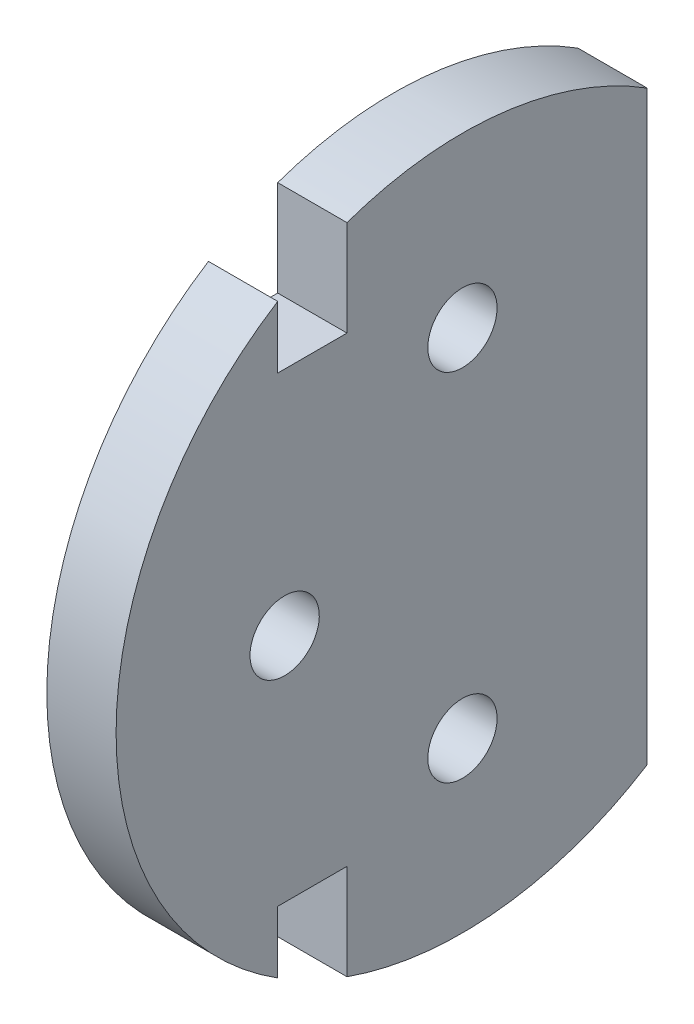
ISO-10303-21;
HEADER;
FILE_DESCRIPTION(('STEP AP214'),'2;1');
FILE_NAME('part.step','',(''),(''),'','','');
FILE_SCHEMA(('AUTOMOTIVE_DESIGN { 1 0 10303 214 1 1 1 1 }'));
ENDSEC;
DATA;
#1=APPLICATION_CONTEXT('core data for automotive mechanical design processes');
#2=APPLICATION_PROTOCOL_DEFINITION('international standard','automotive_design',2000,#1);
#3=PRODUCT_CONTEXT('',#1,'mechanical');
#4=PRODUCT('Part','Part','',(#3));
#5=PRODUCT_RELATED_PRODUCT_CATEGORY('part','',(#4));
#6=PRODUCT_DEFINITION_FORMATION('','',#4);
#7=PRODUCT_DEFINITION_CONTEXT('part definition',#1,'design');
#8=PRODUCT_DEFINITION('design','',#6,#7);
#9=PRODUCT_DEFINITION_SHAPE('','',#8);
#10=(LENGTH_UNIT() NAMED_UNIT(*) SI_UNIT(.MILLI.,.METRE.));
#11=(NAMED_UNIT(*) PLANE_ANGLE_UNIT() SI_UNIT($,.RADIAN.));
#12=(NAMED_UNIT(*) SI_UNIT($,.STERADIAN.) SOLID_ANGLE_UNIT());
#13=UNCERTAINTY_MEASURE_WITH_UNIT(LENGTH_MEASURE(1.E-05),#10,'distance_accuracy_value','');
#14=(GEOMETRIC_REPRESENTATION_CONTEXT(3) GLOBAL_UNCERTAINTY_ASSIGNED_CONTEXT((#13)) GLOBAL_UNIT_ASSIGNED_CONTEXT((#10,
#11,#12)) REPRESENTATION_CONTEXT('',''));
#15=CARTESIAN_POINT('',(0.,0.,0.));
#16=DIRECTION('',(0.,0.,1.));
#17=DIRECTION('',(1.,0.,0.));
#18=AXIS2_PLACEMENT_3D('',#15,#16,#17);
#19=CARTESIAN_POINT('',(-3.,0.,0.));
#20=DIRECTION('',(1.,0.,0.));
#21=DIRECTION('',(0.,0.,-1.));
#22=AXIS2_PLACEMENT_3D('',#19,#20,#21);
#23=CYLINDRICAL_SURFACE('',#22,15.);
#24=CARTESIAN_POINT('',(0.,0.,0.));
#25=DIRECTION('',(-1.,0.,0.));
#26=DIRECTION('',(0.,1.,0.));
#27=AXIS2_PLACEMENT_3D('',#24,#25,#26);
#28=CIRCLE('',#27,15.);
#29=CARTESIAN_POINT('',(0.,-12.6885775404495,8.));
#30=VERTEX_POINT('',#29);
#31=CARTESIAN_POINT('',(0.,12.6885775404495,8.));
#32=VERTEX_POINT('',#31);
#33=EDGE_CURVE('E141',#30,#32,#28,.T.);
#34=ORIENTED_EDGE('',*,*,#33,.T.);
#35=DIRECTION('',(1.,0.,0.));
#36=VECTOR('',#35,1.);
#37=CARTESIAN_POINT('',(-3.,12.6885775404495,8.));
#38=LINE('',#37,#36);
#39=CARTESIAN_POINT('',(-3.,12.6885775404495,8.));
#40=VERTEX_POINT('',#39);
#41=EDGE_CURVE('E10',#40,#32,#38,.T.);
#42=ORIENTED_EDGE('',*,*,#41,.F.);
#43=CARTESIAN_POINT('',(-3.,0.,0.));
#44=DIRECTION('',(-1.,0.,0.));
#45=DIRECTION('',(0.,1.,0.));
#46=AXIS2_PLACEMENT_3D('',#43,#44,#45);
#47=CIRCLE('',#46,15.);
#48=CARTESIAN_POINT('',(-3.,-12.6885775404495,8.));
#49=VERTEX_POINT('',#48);
#50=EDGE_CURVE('E125',#49,#40,#47,.T.);
#51=ORIENTED_EDGE('',*,*,#50,.F.);
#52=DIRECTION('',(1.,0.,0.));
#53=VECTOR('',#52,1.);
#54=CARTESIAN_POINT('',(-3.,-12.6885775404495,8.));
#55=LINE('',#54,#53);
#56=EDGE_CURVE('E136',#49,#30,#55,.T.);
#57=ORIENTED_EDGE('',*,*,#56,.T.);
#58=EDGE_LOOP('',(#34,#42,#51,#57));
#59=FACE_BOUND('',#58,.T.);
#60=ADVANCED_FACE('F16',(#59),#23,.T.);
#61=CARTESIAN_POINT('',(-3.,12.6885775404495,8.));
#62=DIRECTION('',(0.,0.,1.));
#63=DIRECTION('',(0.,-1.,0.));
#64=AXIS2_PLACEMENT_3D('',#61,#62,#63);
#65=PLANE('',#64);
#66=DIRECTION('',(0.,-1.,0.));
#67=VECTOR('',#66,1.);
#68=CARTESIAN_POINT('',(0.,12.6885775404495,8.));
#69=LINE('',#68,#67);
#70=CARTESIAN_POINT('',(0.,10.,8.));
#71=VERTEX_POINT('',#70);
#72=EDGE_CURVE('E137',#32,#71,#69,.T.);
#73=ORIENTED_EDGE('',*,*,#72,.T.);
#74=DIRECTION('',(1.,0.,0.));
#75=VECTOR('',#74,1.);
#76=CARTESIAN_POINT('',(-3.,10.,8.));
#77=LINE('',#76,#75);
#78=CARTESIAN_POINT('',(-3.,10.,8.));
#79=VERTEX_POINT('',#78);
#80=EDGE_CURVE('E24',#79,#71,#77,.T.);
#81=ORIENTED_EDGE('',*,*,#80,.F.);
#82=DIRECTION('',(0.,-1.,0.));
#83=VECTOR('',#82,1.);
#84=CARTESIAN_POINT('',(-3.,12.6885775404495,8.));
#85=LINE('',#84,#83);
#86=EDGE_CURVE('E81',#40,#79,#85,.T.);
#87=ORIENTED_EDGE('',*,*,#86,.F.);
#88=ORIENTED_EDGE('',*,*,#41,.T.);
#89=EDGE_LOOP('',(#73,#81,#87,#88));
#90=FACE_BOUND('',#89,.T.);
#91=ADVANCED_FACE('F224',(#90),#65,.F.);
#92=CARTESIAN_POINT('',(-3.,10.,8.));
#93=DIRECTION('',(0.,-1.,0.));
#94=DIRECTION('',(0.,0.,-1.));
#95=AXIS2_PLACEMENT_3D('',#92,#93,#94);
#96=PLANE('',#95);
#97=DIRECTION('',(0.,0.,-1.));
#98=VECTOR('',#97,1.);
#99=CARTESIAN_POINT('',(0.,10.,8.));
#100=LINE('',#99,#98);
#101=CARTESIAN_POINT('',(0.,10.,5.00000000000001));
#102=VERTEX_POINT('',#101);
#103=EDGE_CURVE('E140',#71,#102,#100,.T.);
#104=ORIENTED_EDGE('',*,*,#103,.T.);
#105=DIRECTION('',(1.,0.,0.));
#106=VECTOR('',#105,1.);
#107=CARTESIAN_POINT('',(-3.,10.,5.00000000000001));
#108=LINE('',#107,#106);
#109=CARTESIAN_POINT('',(-3.,10.,5.00000000000001));
#110=VERTEX_POINT('',#109);
#111=EDGE_CURVE('E188',#110,#102,#108,.T.);
#112=ORIENTED_EDGE('',*,*,#111,.F.);
#113=DIRECTION('',(0.,0.,-1.));
#114=VECTOR('',#113,1.);
#115=CARTESIAN_POINT('',(-3.,10.,8.));
#116=LINE('',#115,#114);
#117=EDGE_CURVE('E196',#79,#110,#116,.T.);
#118=ORIENTED_EDGE('',*,*,#117,.F.);
#119=ORIENTED_EDGE('',*,*,#80,.T.);
#120=EDGE_LOOP('',(#104,#112,#118,#119));
#121=FACE_BOUND('',#120,.T.);
#122=ADVANCED_FACE('F194',(#121),#96,.F.);
#123=CARTESIAN_POINT('',(-3.,10.,5.00000000000001));
#124=DIRECTION('',(0.,0.,-1.));
#125=DIRECTION('',(0.,1.,0.));
#126=AXIS2_PLACEMENT_3D('',#123,#124,#125);
#127=PLANE('',#126);
#128=DIRECTION('',(0.,1.,0.));
#129=VECTOR('',#128,1.);
#130=CARTESIAN_POINT('',(0.,10.,5.00000000000001));
#131=LINE('',#130,#129);
#132=CARTESIAN_POINT('',(0.,14.142135623731,5.));
#133=VERTEX_POINT('',#132);
#134=EDGE_CURVE('E144',#102,#133,#131,.T.);
#135=ORIENTED_EDGE('',*,*,#134,.T.);
#136=DIRECTION('',(1.,0.,0.));
#137=VECTOR('',#136,1.);
#138=CARTESIAN_POINT('',(-3.,14.142135623731,5.));
#139=LINE('',#138,#137);
#140=CARTESIAN_POINT('',(-3.,14.142135623731,5.));
#141=VERTEX_POINT('',#140);
#142=EDGE_CURVE('E185',#141,#133,#139,.T.);
#143=ORIENTED_EDGE('',*,*,#142,.F.);
#144=DIRECTION('',(0.,1.,0.));
#145=VECTOR('',#144,1.);
#146=CARTESIAN_POINT('',(-3.,10.,5.00000000000001));
#147=LINE('',#146,#145);
#148=EDGE_CURVE('E215',#110,#141,#147,.T.);
#149=ORIENTED_EDGE('',*,*,#148,.F.);
#150=ORIENTED_EDGE('',*,*,#111,.T.);
#151=EDGE_LOOP('',(#135,#143,#149,#150));
#152=FACE_BOUND('',#151,.T.);
#153=ADVANCED_FACE('F206',(#152),#127,.F.);
#154=CARTESIAN_POINT('',(-3.,0.,0.));
#155=DIRECTION('',(1.,0.,0.));
#156=DIRECTION('',(0.,0.,-1.));
#157=AXIS2_PLACEMENT_3D('',#154,#155,#156);
#158=CYLINDRICAL_SURFACE('',#157,15.);
#159=CARTESIAN_POINT('',(0.,0.,0.));
#160=DIRECTION('',(-1.,0.,0.));
#161=DIRECTION('',(0.,-1.,0.));
#162=AXIS2_PLACEMENT_3D('',#159,#160,#161);
#163=CIRCLE('',#162,15.);
#164=CARTESIAN_POINT('',(0.,12.6885775404495,-7.99999999999999));
#165=VERTEX_POINT('',#164);
#166=EDGE_CURVE('E147',#133,#165,#163,.T.);
#167=ORIENTED_EDGE('',*,*,#166,.T.);
#168=DIRECTION('',(1.,0.,0.));
#169=VECTOR('',#168,1.);
#170=CARTESIAN_POINT('',(-3.,12.6885775404495,-7.99999999999999));
#171=LINE('',#170,#169);
#172=CARTESIAN_POINT('',(-3.,12.6885775404495,-7.99999999999999));
#173=VERTEX_POINT('',#172);
#174=EDGE_CURVE('E182',#173,#165,#171,.T.);
#175=ORIENTED_EDGE('',*,*,#174,.F.);
#176=CARTESIAN_POINT('',(-3.,0.,0.));
#177=DIRECTION('',(-1.,0.,0.));
#178=DIRECTION('',(0.,-1.,0.));
#179=AXIS2_PLACEMENT_3D('',#176,#177,#178);
#180=CIRCLE('',#179,15.);
#181=EDGE_CURVE('E212',#141,#173,#180,.T.);
#182=ORIENTED_EDGE('',*,*,#181,.F.);
#183=ORIENTED_EDGE('',*,*,#142,.T.);
#184=EDGE_LOOP('',(#167,#175,#182,#183));
#185=FACE_BOUND('',#184,.T.);
#186=ADVANCED_FACE('F210',(#185),#158,.T.);
#187=CARTESIAN_POINT('',(-3.,12.6885775404495,-8.));
#188=DIRECTION('',(0.,0.,1.));
#189=DIRECTION('',(1.,0.,0.));
#190=AXIS2_PLACEMENT_3D('',#187,#188,#189);
#191=PLANE('',#190);
#192=DIRECTION('',(0.,-1.,0.));
#193=VECTOR('',#192,1.);
#194=CARTESIAN_POINT('',(0.,12.6885775404495,-8.));
#195=LINE('',#194,#193);
#196=CARTESIAN_POINT('',(0.,-12.6885775404495,-8.));
#197=VERTEX_POINT('',#196);
#198=EDGE_CURVE('E150',#165,#197,#195,.T.);
#199=ORIENTED_EDGE('',*,*,#198,.T.);
#200=DIRECTION('',(1.,0.,0.));
#201=VECTOR('',#200,1.);
#202=CARTESIAN_POINT('',(-3.,-12.6885775404495,-8.));
#203=LINE('',#202,#201);
#204=CARTESIAN_POINT('',(-3.,-12.6885775404495,-8.));
#205=VERTEX_POINT('',#204);
#206=EDGE_CURVE('E179',#205,#197,#203,.T.);
#207=ORIENTED_EDGE('',*,*,#206,.F.);
#208=DIRECTION('',(0.,-1.,0.));
#209=VECTOR('',#208,1.);
#210=CARTESIAN_POINT('',(-3.,12.6885775404495,-8.));
#211=LINE('',#210,#209);
#212=EDGE_CURVE('E214',#173,#205,#211,.T.);
#213=ORIENTED_EDGE('',*,*,#212,.F.);
#214=ORIENTED_EDGE('',*,*,#174,.T.);
#215=EDGE_LOOP('',(#199,#207,#213,#214));
#216=FACE_BOUND('',#215,.T.);
#217=ADVANCED_FACE('F237',(#216),#191,.F.);
#218=CARTESIAN_POINT('',(-3.,0.,0.));
#219=DIRECTION('',(1.,0.,0.));
#220=DIRECTION('',(0.,0.,-1.));
#221=AXIS2_PLACEMENT_3D('',#218,#219,#220);
#222=CYLINDRICAL_SURFACE('',#221,15.);
#223=CARTESIAN_POINT('',(0.,0.,0.));
#224=DIRECTION('',(-1.,0.,0.));
#225=DIRECTION('',(0.,1.,0.));
#226=AXIS2_PLACEMENT_3D('',#223,#224,#225);
#227=CIRCLE('',#226,15.);
#228=CARTESIAN_POINT('',(0.,-14.1421356237309,5.));
#229=VERTEX_POINT('',#228);
#230=EDGE_CURVE('E153',#197,#229,#227,.T.);
#231=ORIENTED_EDGE('',*,*,#230,.T.);
#232=DIRECTION('',(1.,0.,0.));
#233=VECTOR('',#232,1.);
#234=CARTESIAN_POINT('',(-3.,-14.1421356237309,5.));
#235=LINE('',#234,#233);
#236=CARTESIAN_POINT('',(-3.,-14.1421356237309,5.));
#237=VERTEX_POINT('',#236);
#238=EDGE_CURVE('E116',#237,#229,#235,.T.);
#239=ORIENTED_EDGE('',*,*,#238,.F.);
#240=CARTESIAN_POINT('',(-3.,0.,0.));
#241=DIRECTION('',(-1.,0.,0.));
#242=DIRECTION('',(0.,1.,0.));
#243=AXIS2_PLACEMENT_3D('',#240,#241,#242);
#244=CIRCLE('',#243,15.);
#245=EDGE_CURVE('E107',#205,#237,#244,.T.);
#246=ORIENTED_EDGE('',*,*,#245,.F.);
#247=ORIENTED_EDGE('',*,*,#206,.T.);
#248=EDGE_LOOP('',(#231,#239,#246,#247));
#249=FACE_BOUND('',#248,.T.);
#250=ADVANCED_FACE('F240',(#249),#222,.T.);
#251=CARTESIAN_POINT('',(-3.,-10.,5.00000000000001));
#252=DIRECTION('',(0.,0.,-1.));
#253=DIRECTION('',(0.,1.,0.));
#254=AXIS2_PLACEMENT_3D('',#251,#252,#253);
#255=PLANE('',#254);
#256=DIRECTION('',(0.,1.,0.));
#257=VECTOR('',#256,1.);
#258=CARTESIAN_POINT('',(0.,-10.,5.00000000000001));
#259=LINE('',#258,#257);
#260=CARTESIAN_POINT('',(0.,-10.,5.00000000000001));
#261=VERTEX_POINT('',#260);
#262=EDGE_CURVE('E115',#229,#261,#259,.T.);
#263=ORIENTED_EDGE('',*,*,#262,.T.);
#264=DIRECTION('',(1.,0.,0.));
#265=VECTOR('',#264,1.);
#266=CARTESIAN_POINT('',(-3.,-10.,5.00000000000001));
#267=LINE('',#266,#265);
#268=CARTESIAN_POINT('',(-3.,-10.,5.00000000000001));
#269=VERTEX_POINT('',#268);
#270=EDGE_CURVE('E112',#269,#261,#267,.T.);
#271=ORIENTED_EDGE('',*,*,#270,.F.);
#272=DIRECTION('',(0.,1.,0.));
#273=VECTOR('',#272,1.);
#274=CARTESIAN_POINT('',(-3.,-10.,5.00000000000001));
#275=LINE('',#274,#273);
#276=EDGE_CURVE('E100',#237,#269,#275,.T.);
#277=ORIENTED_EDGE('',*,*,#276,.F.);
#278=ORIENTED_EDGE('',*,*,#238,.T.);
#279=EDGE_LOOP('',(#263,#271,#277,#278));
#280=FACE_BOUND('',#279,.T.);
#281=ADVANCED_FACE('F113',(#280),#255,.F.);
#282=CARTESIAN_POINT('',(-3.,-10.,8.));
#283=DIRECTION('',(0.,1.,0.));
#284=DIRECTION('',(0.,0.,1.));
#285=AXIS2_PLACEMENT_3D('',#282,#283,#284);
#286=PLANE('',#285);
#287=DIRECTION('',(0.,0.,1.));
#288=VECTOR('',#287,1.);
#289=CARTESIAN_POINT('',(0.,-10.,8.));
#290=LINE('',#289,#288);
#291=CARTESIAN_POINT('',(0.,-10.,8.));
#292=VERTEX_POINT('',#291);
#293=EDGE_CURVE('E67',#261,#292,#290,.T.);
#294=ORIENTED_EDGE('',*,*,#293,.T.);
#295=DIRECTION('',(1.,0.,0.));
#296=VECTOR('',#295,1.);
#297=CARTESIAN_POINT('',(-3.,-10.,8.));
#298=LINE('',#297,#296);
#299=CARTESIAN_POINT('',(-3.,-10.,8.));
#300=VERTEX_POINT('',#299);
#301=EDGE_CURVE('E117',#300,#292,#298,.T.);
#302=ORIENTED_EDGE('',*,*,#301,.F.);
#303=DIRECTION('',(0.,0.,1.));
#304=VECTOR('',#303,1.);
#305=CARTESIAN_POINT('',(-3.,-10.,8.));
#306=LINE('',#305,#304);
#307=EDGE_CURVE('E105',#269,#300,#306,.T.);
#308=ORIENTED_EDGE('',*,*,#307,.F.);
#309=ORIENTED_EDGE('',*,*,#270,.T.);
#310=EDGE_LOOP('',(#294,#302,#308,#309));
#311=FACE_BOUND('',#310,.T.);
#312=ADVANCED_FACE('F119',(#311),#286,.F.);
#313=CARTESIAN_POINT('',(-3.,0.,7.70000000000001));
#314=DIRECTION('',(1.,0.,0.));
#315=DIRECTION('',(0.,0.,-1.));
#316=AXIS2_PLACEMENT_3D('',#313,#314,#315);
#317=CYLINDRICAL_SURFACE('',#316,1.5);
#318=CARTESIAN_POINT('',(-3.,0.,7.70000000000001));
#319=DIRECTION('',(1.,0.,0.));
#320=DIRECTION('',(0.,1.,0.));
#321=AXIS2_PLACEMENT_3D('',#318,#319,#320);
#322=CIRCLE('',#321,1.5);
#323=CARTESIAN_POINT('',(-3.,1.5,7.70000000000001));
#324=VERTEX_POINT('',#323);
#325=EDGE_CURVE('E121',#324,#324,#322,.T.);
#326=ORIENTED_EDGE('',*,*,#325,.F.);
#327=EDGE_LOOP('',(#326));
#328=FACE_BOUND('',#327,.T.);
#329=CARTESIAN_POINT('',(0.,0.,7.70000000000001));
#330=DIRECTION('',(1.,0.,0.));
#331=DIRECTION('',(0.,1.,0.));
#332=AXIS2_PLACEMENT_3D('',#329,#330,#331);
#333=CIRCLE('',#332,1.5);
#334=CARTESIAN_POINT('',(0.,1.5,7.70000000000001));
#335=VERTEX_POINT('',#334);
#336=EDGE_CURVE('E162',#335,#335,#333,.T.);
#337=ORIENTED_EDGE('',*,*,#336,.T.);
#338=EDGE_LOOP('',(#337));
#339=FACE_BOUND('',#338,.T.);
#340=ADVANCED_FACE('F249',(#328,#339),#317,.F.);
#341=CARTESIAN_POINT('',(-3.,-12.6885775404495,8.));
#342=DIRECTION('',(0.,0.,1.));
#343=DIRECTION('',(0.,-1.,0.));
#344=AXIS2_PLACEMENT_3D('',#341,#342,#343);
#345=PLANE('',#344);
#346=DIRECTION('',(0.,-1.,0.));
#347=VECTOR('',#346,1.);
#348=CARTESIAN_POINT('',(0.,-12.6885775404495,8.));
#349=LINE('',#348,#347);
#350=EDGE_CURVE('E73',#292,#30,#349,.T.);
#351=ORIENTED_EDGE('',*,*,#350,.T.);
#352=ORIENTED_EDGE('',*,*,#56,.F.);
#353=DIRECTION('',(0.,-1.,0.));
#354=VECTOR('',#353,1.);
#355=CARTESIAN_POINT('',(-3.,-12.6885775404495,8.));
#356=LINE('',#355,#354);
#357=EDGE_CURVE('E32',#300,#49,#356,.T.);
#358=ORIENTED_EDGE('',*,*,#357,.F.);
#359=ORIENTED_EDGE('',*,*,#301,.T.);
#360=EDGE_LOOP('',(#351,#352,#358,#359));
#361=FACE_BOUND('',#360,.T.);
#362=ADVANCED_FACE('F250',(#361),#345,.F.);
#363=CARTESIAN_POINT('',(-3.,7.7,0.));
#364=DIRECTION('',(1.,0.,0.));
#365=DIRECTION('',(0.,0.,-1.));
#366=AXIS2_PLACEMENT_3D('',#363,#364,#365);
#367=CYLINDRICAL_SURFACE('',#366,1.5);
#368=CARTESIAN_POINT('',(-3.,7.7,0.));
#369=DIRECTION('',(1.,0.,0.));
#370=DIRECTION('',(0.,1.,0.));
#371=AXIS2_PLACEMENT_3D('',#368,#369,#370);
#372=CIRCLE('',#371,1.5);
#373=CARTESIAN_POINT('',(-3.,9.2,0.));
#374=VERTEX_POINT('',#373);
#375=EDGE_CURVE('E130',#374,#374,#372,.T.);
#376=ORIENTED_EDGE('',*,*,#375,.F.);
#377=EDGE_LOOP('',(#376));
#378=FACE_BOUND('',#377,.T.);
#379=CARTESIAN_POINT('',(0.,7.7,0.));
#380=DIRECTION('',(1.,0.,0.));
#381=DIRECTION('',(0.,1.,0.));
#382=AXIS2_PLACEMENT_3D('',#379,#380,#381);
#383=CIRCLE('',#382,1.5);
#384=CARTESIAN_POINT('',(0.,9.2,0.));
#385=VERTEX_POINT('',#384);
#386=EDGE_CURVE('E169',#385,#385,#383,.T.);
#387=ORIENTED_EDGE('',*,*,#386,.T.);
#388=EDGE_LOOP('',(#387));
#389=FACE_BOUND('',#388,.T.);
#390=ADVANCED_FACE('F253',(#378,#389),#367,.F.);
#391=CARTESIAN_POINT('',(-3.,-7.7,0.));
#392=DIRECTION('',(1.,0.,0.));
#393=DIRECTION('',(0.,0.,-1.));
#394=AXIS2_PLACEMENT_3D('',#391,#392,#393);
#395=CYLINDRICAL_SURFACE('',#394,1.5);
#396=CARTESIAN_POINT('',(-3.,-7.7,0.));
#397=DIRECTION('',(1.,0.,0.));
#398=DIRECTION('',(0.,1.,0.));
#399=AXIS2_PLACEMENT_3D('',#396,#397,#398);
#400=CIRCLE('',#399,1.5);
#401=CARTESIAN_POINT('',(-3.,-6.2,0.));
#402=VERTEX_POINT('',#401);
#403=EDGE_CURVE('E133',#402,#402,#400,.T.);
#404=ORIENTED_EDGE('',*,*,#403,.F.);
#405=EDGE_LOOP('',(#404));
#406=FACE_BOUND('',#405,.T.);
#407=CARTESIAN_POINT('',(0.,-7.7,0.));
#408=DIRECTION('',(1.,0.,0.));
#409=DIRECTION('',(0.,1.,0.));
#410=AXIS2_PLACEMENT_3D('',#407,#408,#409);
#411=CIRCLE('',#410,1.5);
#412=CARTESIAN_POINT('',(0.,-6.2,0.));
#413=VERTEX_POINT('',#412);
#414=EDGE_CURVE('E127',#413,#413,#411,.T.);
#415=ORIENTED_EDGE('',*,*,#414,.T.);
#416=EDGE_LOOP('',(#415));
#417=FACE_BOUND('',#416,.T.);
#418=ADVANCED_FACE('F259',(#406,#417),#395,.F.);
#419=CARTESIAN_POINT('',(-3.,0.,0.));
#420=DIRECTION('',(-1.,0.,0.));
#421=DIRECTION('',(0.,-1.,0.));
#422=AXIS2_PLACEMENT_3D('',#419,#420,#421);
#423=PLANE('',#422);
#424=ORIENTED_EDGE('',*,*,#375,.T.);
#425=EDGE_LOOP('',(#424));
#426=FACE_BOUND('',#425,.T.);
#427=ORIENTED_EDGE('',*,*,#50,.T.);
#428=ORIENTED_EDGE('',*,*,#86,.T.);
#429=ORIENTED_EDGE('',*,*,#117,.T.);
#430=ORIENTED_EDGE('',*,*,#148,.T.);
#431=ORIENTED_EDGE('',*,*,#181,.T.);
#432=ORIENTED_EDGE('',*,*,#212,.T.);
#433=ORIENTED_EDGE('',*,*,#245,.T.);
#434=ORIENTED_EDGE('',*,*,#276,.T.);
#435=ORIENTED_EDGE('',*,*,#307,.T.);
#436=ORIENTED_EDGE('',*,*,#357,.T.);
#437=EDGE_LOOP('',(#427,#428,#429,#430,#431,#432,#433,#434,#435,#436));
#438=FACE_BOUND('',#437,.T.);
#439=ORIENTED_EDGE('',*,*,#325,.T.);
#440=EDGE_LOOP('',(#439));
#441=FACE_BOUND('',#440,.T.);
#442=ORIENTED_EDGE('',*,*,#403,.T.);
#443=EDGE_LOOP('',(#442));
#444=FACE_BOUND('',#443,.T.);
#445=ADVANCED_FACE('F102',(#426,#438,#441,#444),#423,.T.);
#446=CARTESIAN_POINT('',(0.,0.,0.));
#447=DIRECTION('',(-1.,0.,0.));
#448=DIRECTION('',(0.,-1.,0.));
#449=AXIS2_PLACEMENT_3D('',#446,#447,#448);
#450=PLANE('',#449);
#451=ORIENTED_EDGE('',*,*,#386,.F.);
#452=EDGE_LOOP('',(#451));
#453=FACE_BOUND('',#452,.T.);
#454=ORIENTED_EDGE('',*,*,#33,.F.);
#455=ORIENTED_EDGE('',*,*,#350,.F.);
#456=ORIENTED_EDGE('',*,*,#293,.F.);
#457=ORIENTED_EDGE('',*,*,#262,.F.);
#458=ORIENTED_EDGE('',*,*,#230,.F.);
#459=ORIENTED_EDGE('',*,*,#198,.F.);
#460=ORIENTED_EDGE('',*,*,#166,.F.);
#461=ORIENTED_EDGE('',*,*,#134,.F.);
#462=ORIENTED_EDGE('',*,*,#103,.F.);
#463=ORIENTED_EDGE('',*,*,#72,.F.);
#464=EDGE_LOOP('',(#454,#455,#456,#457,#458,#459,#460,#461,#462,#463));
#465=FACE_BOUND('',#464,.T.);
#466=ORIENTED_EDGE('',*,*,#336,.F.);
#467=EDGE_LOOP('',(#466));
#468=FACE_BOUND('',#467,.T.);
#469=ORIENTED_EDGE('',*,*,#414,.F.);
#470=EDGE_LOOP('',(#469));
#471=FACE_BOUND('',#470,.T.);
#472=ADVANCED_FACE('F200',(#453,#465,#468,#471),#450,.F.);
#473=CLOSED_SHELL('',(#60,#91,#122,#153,#186,#217,#250,#281,#312,#340,#362,#390,#418,#445,#472));
#474=MANIFOLD_SOLID_BREP('B1',#473);
#475=ADVANCED_BREP_SHAPE_REPRESENTATION('',(#18,#474),#14);
#476=SHAPE_DEFINITION_REPRESENTATION(#9,#475);
ENDSEC;
END-ISO-10303-21;
